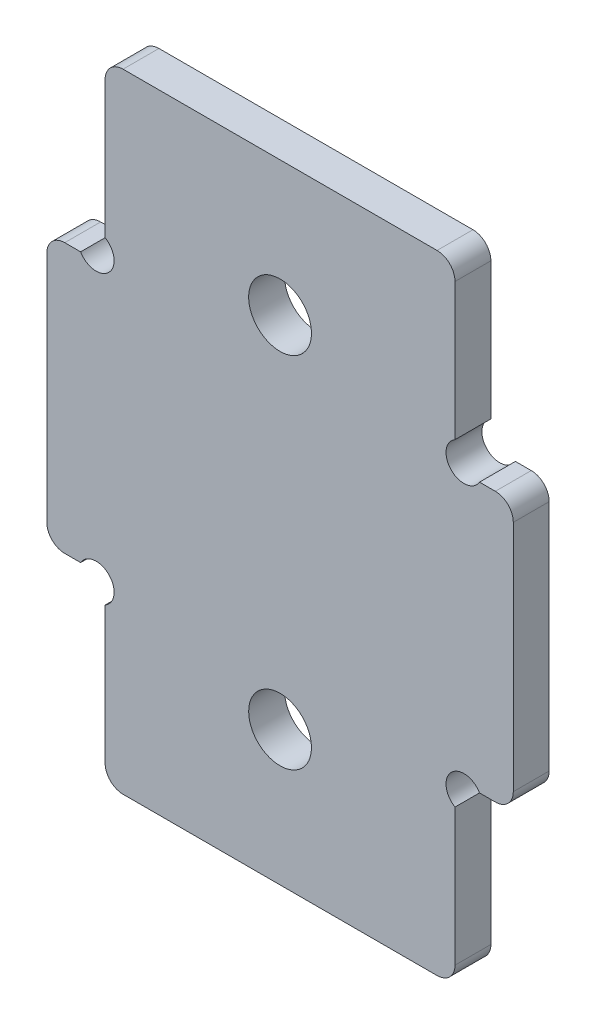
ISO-10303-21;
HEADER;
FILE_DESCRIPTION(('STEP AP214'),'2;1');
FILE_NAME('part.step','',(''),(''),'','','');
FILE_SCHEMA(('AUTOMOTIVE_DESIGN { 1 0 10303 214 1 1 1 1 }'));
ENDSEC;
DATA;
#1=APPLICATION_CONTEXT('core data for automotive mechanical design processes');
#2=APPLICATION_PROTOCOL_DEFINITION('international standard','automotive_design',2000,#1);
#3=PRODUCT_CONTEXT('',#1,'mechanical');
#4=PRODUCT('Part','Part','',(#3));
#5=PRODUCT_RELATED_PRODUCT_CATEGORY('part','',(#4));
#6=PRODUCT_DEFINITION_FORMATION('','',#4);
#7=PRODUCT_DEFINITION_CONTEXT('part definition',#1,'design');
#8=PRODUCT_DEFINITION('design','',#6,#7);
#9=PRODUCT_DEFINITION_SHAPE('','',#8);
#10=(LENGTH_UNIT() NAMED_UNIT(*) SI_UNIT(.MILLI.,.METRE.));
#11=(NAMED_UNIT(*) PLANE_ANGLE_UNIT() SI_UNIT($,.RADIAN.));
#12=(NAMED_UNIT(*) SI_UNIT($,.STERADIAN.) SOLID_ANGLE_UNIT());
#13=UNCERTAINTY_MEASURE_WITH_UNIT(LENGTH_MEASURE(1.E-05),#10,'distance_accuracy_value','');
#14=(GEOMETRIC_REPRESENTATION_CONTEXT(3) GLOBAL_UNCERTAINTY_ASSIGNED_CONTEXT((#13)) GLOBAL_UNIT_ASSIGNED_CONTEXT((#10,
#11,#12)) REPRESENTATION_CONTEXT('',''));
#15=CARTESIAN_POINT('',(0.,0.,0.));
#16=DIRECTION('',(0.,0.,1.));
#17=DIRECTION('',(1.,0.,0.));
#18=AXIS2_PLACEMENT_3D('',#15,#16,#17);
#19=CARTESIAN_POINT('',(0.,35.,2.));
#20=DIRECTION('',(1.,0.,0.));
#21=DIRECTION('',(0.,1.,0.));
#22=AXIS2_PLACEMENT_3D('',#19,#20,#21);
#23=PLANE('',#22);
#24=DIRECTION('',(0.,-1.,0.));
#25=VECTOR('',#24,1.);
#26=CARTESIAN_POINT('',(0.,35.,0.));
#27=LINE('',#26,#25);
#28=CARTESIAN_POINT('',(0.,8.63397459621554,0.));
#29=VERTEX_POINT('',#28);
#30=CARTESIAN_POINT('',(0.,1.,0.));
#31=VERTEX_POINT('',#30);
#32=EDGE_CURVE('E284',#29,#31,#27,.T.);
#33=ORIENTED_EDGE('',*,*,#32,.T.);
#34=DIRECTION('',(0.,0.,-1.));
#35=VECTOR('',#34,1.);
#36=CARTESIAN_POINT('',(0.,1.,2.));
#37=LINE('',#36,#35);
#38=CARTESIAN_POINT('',(0.,1.,2.));
#39=VERTEX_POINT('',#38);
#40=EDGE_CURVE('E356',#31,#39,#37,.F.);
#41=ORIENTED_EDGE('',*,*,#40,.T.);
#42=DIRECTION('',(0.,-1.,0.));
#43=VECTOR('',#42,1.);
#44=CARTESIAN_POINT('',(0.,35.,2.));
#45=LINE('',#44,#43);
#46=CARTESIAN_POINT('',(0.,8.63397459621554,2.));
#47=VERTEX_POINT('',#46);
#48=EDGE_CURVE('E274',#47,#39,#45,.T.);
#49=ORIENTED_EDGE('',*,*,#48,.F.);
#50=DIRECTION('',(0.,0.,1.));
#51=VECTOR('',#50,1.);
#52=CARTESIAN_POINT('',(0.,8.63397459621554,-8.));
#53=LINE('',#52,#51);
#54=EDGE_CURVE('E397',#47,#29,#53,.F.);
#55=ORIENTED_EDGE('',*,*,#54,.T.);
#56=EDGE_LOOP('',(#33,#41,#49,#55));
#57=FACE_BOUND('',#56,.T.);
#58=ADVANCED_FACE('F41',(#57),#23,.F.);
#59=CARTESIAN_POINT('',(19.5,0.,2.));
#60=DIRECTION('',(-1.,0.,0.));
#61=DIRECTION('',(0.,0.,1.));
#62=AXIS2_PLACEMENT_3D('',#59,#60,#61);
#63=PLANE('',#62);
#64=DIRECTION('',(0.,1.,0.));
#65=VECTOR('',#64,1.);
#66=CARTESIAN_POINT('',(19.5,0.,0.));
#67=LINE('',#66,#65);
#68=CARTESIAN_POINT('',(19.5,26.3660254037844,0.));
#69=VERTEX_POINT('',#68);
#70=CARTESIAN_POINT('',(19.5,34.,0.));
#71=VERTEX_POINT('',#70);
#72=EDGE_CURVE('E290',#69,#71,#67,.T.);
#73=ORIENTED_EDGE('',*,*,#72,.T.);
#74=DIRECTION('',(0.,0.,-1.));
#75=VECTOR('',#74,1.);
#76=CARTESIAN_POINT('',(19.5,34.,2.));
#77=LINE('',#76,#75);
#78=CARTESIAN_POINT('',(19.5,34.,2.));
#79=VERTEX_POINT('',#78);
#80=EDGE_CURVE('E11',#71,#79,#77,.F.);
#81=ORIENTED_EDGE('',*,*,#80,.T.);
#82=DIRECTION('',(0.,1.,0.));
#83=VECTOR('',#82,1.);
#84=CARTESIAN_POINT('',(19.5,0.,2.));
#85=LINE('',#84,#83);
#86=CARTESIAN_POINT('',(19.5,26.3660254037844,2.));
#87=VERTEX_POINT('',#86);
#88=EDGE_CURVE('E280',#87,#79,#85,.T.);
#89=ORIENTED_EDGE('',*,*,#88,.F.);
#90=DIRECTION('',(0.,0.,1.));
#91=VECTOR('',#90,1.);
#92=CARTESIAN_POINT('',(19.5,26.3660254037844,-8.));
#93=LINE('',#92,#91);
#94=EDGE_CURVE('E403',#87,#69,#93,.F.);
#95=ORIENTED_EDGE('',*,*,#94,.T.);
#96=EDGE_LOOP('',(#73,#81,#89,#95));
#97=FACE_BOUND('',#96,.T.);
#98=ADVANCED_FACE('F456',(#97),#63,.F.);
#99=CARTESIAN_POINT('',(19.5,35.,2.));
#100=DIRECTION('',(0.,-1.,0.));
#101=DIRECTION('',(0.,0.,-1.));
#102=AXIS2_PLACEMENT_3D('',#99,#100,#101);
#103=PLANE('',#102);
#104=DIRECTION('',(-1.,0.,0.));
#105=VECTOR('',#104,1.);
#106=CARTESIAN_POINT('',(19.5,35.,0.));
#107=LINE('',#106,#105);
#108=CARTESIAN_POINT('',(18.5,35.,0.));
#109=VERTEX_POINT('',#108);
#110=CARTESIAN_POINT('',(1.,35.,0.));
#111=VERTEX_POINT('',#110);
#112=EDGE_CURVE('E263',#109,#111,#107,.T.);
#113=ORIENTED_EDGE('',*,*,#112,.T.);
#114=DIRECTION('',(0.,0.,-1.));
#115=VECTOR('',#114,1.);
#116=CARTESIAN_POINT('',(1.,35.,2.));
#117=LINE('',#116,#115);
#118=CARTESIAN_POINT('',(1.,35.,2.));
#119=VERTEX_POINT('',#118);
#120=EDGE_CURVE('E321',#111,#119,#117,.F.);
#121=ORIENTED_EDGE('',*,*,#120,.T.);
#122=DIRECTION('',(-1.,0.,0.));
#123=VECTOR('',#122,1.);
#124=CARTESIAN_POINT('',(19.5,35.,2.));
#125=LINE('',#124,#123);
#126=CARTESIAN_POINT('',(18.5,35.,2.));
#127=VERTEX_POINT('',#126);
#128=EDGE_CURVE('E272',#127,#119,#125,.T.);
#129=ORIENTED_EDGE('',*,*,#128,.F.);
#130=DIRECTION('',(0.,0.,-1.));
#131=VECTOR('',#130,1.);
#132=CARTESIAN_POINT('',(18.5,35.,2.));
#133=LINE('',#132,#131);
#134=EDGE_CURVE('E318',#127,#109,#133,.T.);
#135=ORIENTED_EDGE('',*,*,#134,.T.);
#136=EDGE_LOOP('',(#113,#121,#129,#135));
#137=FACE_BOUND('',#136,.T.);
#138=ADVANCED_FACE('F463',(#137),#103,.F.);
#139=CARTESIAN_POINT('',(0.,34.,2.));
#140=VERTEX_POINT('',#139);
#141=CARTESIAN_POINT('',(0.,26.3660254037844,2.));
#142=VERTEX_POINT('',#141);
#143=EDGE_CURVE('E223',#140,#142,#45,.T.);
#144=ORIENTED_EDGE('',*,*,#143,.F.);
#145=DIRECTION('',(0.,0.,-1.));
#146=VECTOR('',#145,1.);
#147=CARTESIAN_POINT('',(0.,34.,2.));
#148=LINE('',#147,#146);
#149=CARTESIAN_POINT('',(0.,34.,0.));
#150=VERTEX_POINT('',#149);
#151=EDGE_CURVE('E299',#140,#150,#148,.T.);
#152=ORIENTED_EDGE('',*,*,#151,.T.);
#153=CARTESIAN_POINT('',(0.,26.3660254037844,0.));
#154=VERTEX_POINT('',#153);
#155=EDGE_CURVE('E285',#150,#154,#27,.T.);
#156=ORIENTED_EDGE('',*,*,#155,.T.);
#157=DIRECTION('',(0.,0.,1.));
#158=VECTOR('',#157,1.);
#159=CARTESIAN_POINT('',(0.,26.3660254037844,-8.));
#160=LINE('',#159,#158);
#161=EDGE_CURVE('E388',#154,#142,#160,.T.);
#162=ORIENTED_EDGE('',*,*,#161,.T.);
#163=EDGE_LOOP('',(#144,#152,#156,#162));
#164=FACE_BOUND('',#163,.T.);
#165=ADVANCED_FACE('F470',(#164),#23,.F.);
#166=CARTESIAN_POINT('',(0.,0.,2.));
#167=DIRECTION('',(0.,1.,0.));
#168=DIRECTION('',(0.,0.,1.));
#169=AXIS2_PLACEMENT_3D('',#166,#167,#168);
#170=PLANE('',#169);
#171=DIRECTION('',(1.,0.,0.));
#172=VECTOR('',#171,1.);
#173=CARTESIAN_POINT('',(0.,0.,0.));
#174=LINE('',#173,#172);
#175=CARTESIAN_POINT('',(1.,0.,0.));
#176=VERTEX_POINT('',#175);
#177=CARTESIAN_POINT('',(18.5,0.,0.));
#178=VERTEX_POINT('',#177);
#179=EDGE_CURVE('E287',#176,#178,#174,.T.);
#180=ORIENTED_EDGE('',*,*,#179,.T.);
#181=DIRECTION('',(0.,0.,-1.));
#182=VECTOR('',#181,1.);
#183=CARTESIAN_POINT('',(18.5,0.,2.));
#184=LINE('',#183,#182);
#185=CARTESIAN_POINT('',(18.5,0.,2.));
#186=VERTEX_POINT('',#185);
#187=EDGE_CURVE('E354',#178,#186,#184,.F.);
#188=ORIENTED_EDGE('',*,*,#187,.T.);
#189=DIRECTION('',(1.,0.,0.));
#190=VECTOR('',#189,1.);
#191=CARTESIAN_POINT('',(0.,0.,2.));
#192=LINE('',#191,#190);
#193=CARTESIAN_POINT('',(1.,0.,2.));
#194=VERTEX_POINT('',#193);
#195=EDGE_CURVE('E277',#194,#186,#192,.T.);
#196=ORIENTED_EDGE('',*,*,#195,.F.);
#197=DIRECTION('',(0.,0.,-1.));
#198=VECTOR('',#197,1.);
#199=CARTESIAN_POINT('',(1.,0.,2.));
#200=LINE('',#199,#198);
#201=EDGE_CURVE('E351',#194,#176,#200,.T.);
#202=ORIENTED_EDGE('',*,*,#201,.T.);
#203=EDGE_LOOP('',(#180,#188,#196,#202));
#204=FACE_BOUND('',#203,.T.);
#205=ADVANCED_FACE('F472',(#204),#170,.F.);
#206=CARTESIAN_POINT('',(19.5,1.,2.));
#207=VERTEX_POINT('',#206);
#208=CARTESIAN_POINT('',(19.5,8.63397459621554,2.));
#209=VERTEX_POINT('',#208);
#210=EDGE_CURVE('E215',#207,#209,#85,.T.);
#211=ORIENTED_EDGE('',*,*,#210,.F.);
#212=DIRECTION('',(0.,0.,-1.));
#213=VECTOR('',#212,1.);
#214=CARTESIAN_POINT('',(19.5,1.,2.));
#215=LINE('',#214,#213);
#216=CARTESIAN_POINT('',(19.5,1.,0.));
#217=VERTEX_POINT('',#216);
#218=EDGE_CURVE('E348',#207,#217,#215,.T.);
#219=ORIENTED_EDGE('',*,*,#218,.T.);
#220=CARTESIAN_POINT('',(19.5,8.63397459621554,0.));
#221=VERTEX_POINT('',#220);
#222=EDGE_CURVE('E275',#217,#221,#67,.T.);
#223=ORIENTED_EDGE('',*,*,#222,.T.);
#224=DIRECTION('',(0.,0.,1.));
#225=VECTOR('',#224,1.);
#226=CARTESIAN_POINT('',(19.5,8.63397459621554,-8.));
#227=LINE('',#226,#225);
#228=EDGE_CURVE('E243',#221,#209,#227,.T.);
#229=ORIENTED_EDGE('',*,*,#228,.T.);
#230=EDGE_LOOP('',(#211,#219,#223,#229));
#231=FACE_BOUND('',#230,.T.);
#232=ADVANCED_FACE('F427',(#231),#63,.F.);
#233=CARTESIAN_POINT('',(0.,0.,2.));
#234=DIRECTION('',(0.,0.,1.));
#235=DIRECTION('',(1.,0.,0.));
#236=AXIS2_PLACEMENT_3D('',#233,#234,#235);
#237=PLANE('',#236);
#238=ORIENTED_EDGE('',*,*,#128,.T.);
#239=CARTESIAN_POINT('',(1.,34.,2.));
#240=DIRECTION('',(0.,0.,1.));
#241=DIRECTION('',(1.,0.,0.));
#242=AXIS2_PLACEMENT_3D('',#239,#240,#241);
#243=CIRCLE('',#242,1.);
#244=EDGE_CURVE('E336',#119,#140,#243,.T.);
#245=ORIENTED_EDGE('',*,*,#244,.T.);
#246=ORIENTED_EDGE('',*,*,#143,.T.);
#247=CARTESIAN_POINT('',(-0.499999999999997,25.5,2.));
#248=DIRECTION('',(0.,0.,1.));
#249=DIRECTION('',(-1.,0.,0.));
#250=AXIS2_PLACEMENT_3D('',#247,#248,#249);
#251=CIRCLE('',#250,1.);
#252=CARTESIAN_POINT('',(-1.36602540378444,25.,2.));
#253=VERTEX_POINT('',#252);
#254=EDGE_CURVE('E206',#253,#142,#251,.T.);
#255=ORIENTED_EDGE('',*,*,#254,.F.);
#256=DIRECTION('',(-1.,0.,0.));
#257=VECTOR('',#256,1.);
#258=CARTESIAN_POINT('',(0.,25.,2.));
#259=LINE('',#258,#257);
#260=CARTESIAN_POINT('',(-2.25000000000001,25.,2.));
#261=VERTEX_POINT('',#260);
#262=EDGE_CURVE('E221',#253,#261,#259,.T.);
#263=ORIENTED_EDGE('',*,*,#262,.T.);
#264=CARTESIAN_POINT('',(-2.25000000000001,24.,2.));
#265=DIRECTION('',(0.,0.,1.));
#266=DIRECTION('',(1.,0.,0.));
#267=AXIS2_PLACEMENT_3D('',#264,#265,#266);
#268=CIRCLE('',#267,1.);
#269=CARTESIAN_POINT('',(-3.25000000000001,24.,2.));
#270=VERTEX_POINT('',#269);
#271=EDGE_CURVE('E325',#261,#270,#268,.T.);
#272=ORIENTED_EDGE('',*,*,#271,.T.);
#273=DIRECTION('',(0.,-1.,0.));
#274=VECTOR('',#273,1.);
#275=CARTESIAN_POINT('',(-3.25000000000001,25.,2.));
#276=LINE('',#275,#274);
#277=CARTESIAN_POINT('',(-3.25,11.,2.));
#278=VERTEX_POINT('',#277);
#279=EDGE_CURVE('E230',#270,#278,#276,.T.);
#280=ORIENTED_EDGE('',*,*,#279,.T.);
#281=CARTESIAN_POINT('',(-2.25,11.,2.));
#282=DIRECTION('',(0.,0.,1.));
#283=DIRECTION('',(1.,0.,0.));
#284=AXIS2_PLACEMENT_3D('',#281,#282,#283);
#285=CIRCLE('',#284,1.);
#286=CARTESIAN_POINT('',(-2.25,10.,2.));
#287=VERTEX_POINT('',#286);
#288=EDGE_CURVE('E327',#278,#287,#285,.T.);
#289=ORIENTED_EDGE('',*,*,#288,.T.);
#290=DIRECTION('',(1.,0.,0.));
#291=VECTOR('',#290,1.);
#292=CARTESIAN_POINT('',(0.,10.,2.));
#293=LINE('',#292,#291);
#294=CARTESIAN_POINT('',(-1.3660254037844,10.,2.));
#295=VERTEX_POINT('',#294);
#296=EDGE_CURVE('E236',#287,#295,#293,.T.);
#297=ORIENTED_EDGE('',*,*,#296,.T.);
#298=CARTESIAN_POINT('',(-0.499999999999962,9.5,2.));
#299=DIRECTION('',(0.,0.,1.));
#300=DIRECTION('',(1.,0.,0.));
#301=AXIS2_PLACEMENT_3D('',#298,#299,#300);
#302=CIRCLE('',#301,1.);
#303=EDGE_CURVE('E224',#47,#295,#302,.T.);
#304=ORIENTED_EDGE('',*,*,#303,.F.);
#305=ORIENTED_EDGE('',*,*,#48,.T.);
#306=CARTESIAN_POINT('',(1.,1.,2.));
#307=DIRECTION('',(0.,0.,1.));
#308=DIRECTION('',(1.,0.,0.));
#309=AXIS2_PLACEMENT_3D('',#306,#307,#308);
#310=CIRCLE('',#309,1.);
#311=EDGE_CURVE('E329',#39,#194,#310,.T.);
#312=ORIENTED_EDGE('',*,*,#311,.T.);
#313=ORIENTED_EDGE('',*,*,#195,.T.);
#314=CARTESIAN_POINT('',(18.5,1.,2.));
#315=DIRECTION('',(0.,0.,1.));
#316=DIRECTION('',(1.,0.,0.));
#317=AXIS2_PLACEMENT_3D('',#314,#315,#316);
#318=CIRCLE('',#317,1.);
#319=EDGE_CURVE('E331',#186,#207,#318,.T.);
#320=ORIENTED_EDGE('',*,*,#319,.T.);
#321=ORIENTED_EDGE('',*,*,#210,.T.);
#322=CARTESIAN_POINT('',(20.,9.5,2.));
#323=DIRECTION('',(0.,0.,1.));
#324=DIRECTION('',(-1.,0.,0.));
#325=AXIS2_PLACEMENT_3D('',#322,#323,#324);
#326=CIRCLE('',#325,1.);
#327=CARTESIAN_POINT('',(20.8660254037844,10.,2.));
#328=VERTEX_POINT('',#327);
#329=EDGE_CURVE('E393',#328,#209,#326,.T.);
#330=ORIENTED_EDGE('',*,*,#329,.F.);
#331=DIRECTION('',(1.,0.,0.));
#332=VECTOR('',#331,1.);
#333=CARTESIAN_POINT('',(19.5,10.,2.));
#334=LINE('',#333,#332);
#335=CARTESIAN_POINT('',(21.75,10.,2.));
#336=VERTEX_POINT('',#335);
#337=EDGE_CURVE('E229',#328,#336,#334,.T.);
#338=ORIENTED_EDGE('',*,*,#337,.T.);
#339=CARTESIAN_POINT('',(21.75,11.,2.));
#340=DIRECTION('',(0.,0.,1.));
#341=DIRECTION('',(1.,0.,0.));
#342=AXIS2_PLACEMENT_3D('',#339,#340,#341);
#343=CIRCLE('',#342,1.);
#344=CARTESIAN_POINT('',(22.75,11.,2.));
#345=VERTEX_POINT('',#344);
#346=EDGE_CURVE('E333',#336,#345,#343,.T.);
#347=ORIENTED_EDGE('',*,*,#346,.T.);
#348=DIRECTION('',(0.,1.,0.));
#349=VECTOR('',#348,1.);
#350=CARTESIAN_POINT('',(22.75,25.,2.));
#351=LINE('',#350,#349);
#352=CARTESIAN_POINT('',(22.75,24.,2.));
#353=VERTEX_POINT('',#352);
#354=EDGE_CURVE('E233',#345,#353,#351,.T.);
#355=ORIENTED_EDGE('',*,*,#354,.T.);
#356=CARTESIAN_POINT('',(21.75,24.,2.));
#357=DIRECTION('',(0.,0.,1.));
#358=DIRECTION('',(1.,0.,0.));
#359=AXIS2_PLACEMENT_3D('',#356,#357,#358);
#360=CIRCLE('',#359,1.);
#361=CARTESIAN_POINT('',(21.75,25.,2.));
#362=VERTEX_POINT('',#361);
#363=EDGE_CURVE('E62',#353,#362,#360,.T.);
#364=ORIENTED_EDGE('',*,*,#363,.T.);
#365=DIRECTION('',(-1.,0.,0.));
#366=VECTOR('',#365,1.);
#367=CARTESIAN_POINT('',(19.5,25.,2.));
#368=LINE('',#367,#366);
#369=CARTESIAN_POINT('',(20.8660254037844,25.,2.));
#370=VERTEX_POINT('',#369);
#371=EDGE_CURVE('E252',#362,#370,#368,.T.);
#372=ORIENTED_EDGE('',*,*,#371,.T.);
#373=CARTESIAN_POINT('',(20.,25.5,2.));
#374=DIRECTION('',(0.,0.,1.));
#375=DIRECTION('',(1.,0.,0.));
#376=AXIS2_PLACEMENT_3D('',#373,#374,#375);
#377=CIRCLE('',#376,1.);
#378=EDGE_CURVE('E389',#87,#370,#377,.T.);
#379=ORIENTED_EDGE('',*,*,#378,.F.);
#380=ORIENTED_EDGE('',*,*,#88,.T.);
#381=CARTESIAN_POINT('',(18.5,34.,2.));
#382=DIRECTION('',(0.,0.,1.));
#383=DIRECTION('',(1.,0.,0.));
#384=AXIS2_PLACEMENT_3D('',#381,#382,#383);
#385=CIRCLE('',#384,1.);
#386=EDGE_CURVE('E323',#79,#127,#385,.T.);
#387=ORIENTED_EDGE('',*,*,#386,.T.);
#388=EDGE_LOOP('',(#238,#245,#246,#255,#263,#272,#280,#289,#297,#304,#305,#312,#313,#320,#321,
#330,#338,#347,#355,#364,#372,#379,#380,#387));
#389=FACE_BOUND('',#388,.T.);
#390=CARTESIAN_POINT('',(9.75,27.5,2.));
#391=DIRECTION('',(0.,0.,1.));
#392=DIRECTION('',(1.,0.,0.));
#393=AXIS2_PLACEMENT_3D('',#390,#391,#392);
#394=CIRCLE('',#393,1.75);
#395=CARTESIAN_POINT('',(11.5,27.5,2.));
#396=VERTEX_POINT('',#395);
#397=EDGE_CURVE('E264',#396,#396,#394,.T.);
#398=ORIENTED_EDGE('',*,*,#397,.F.);
#399=EDGE_LOOP('',(#398));
#400=FACE_BOUND('',#399,.T.);
#401=CARTESIAN_POINT('',(9.75,7.5,2.));
#402=DIRECTION('',(0.,0.,1.));
#403=DIRECTION('',(-1.,0.,0.));
#404=AXIS2_PLACEMENT_3D('',#401,#402,#403);
#405=CIRCLE('',#404,1.75);
#406=CARTESIAN_POINT('',(8.,7.5,2.));
#407=VERTEX_POINT('',#406);
#408=EDGE_CURVE('E267',#407,#407,#405,.T.);
#409=ORIENTED_EDGE('',*,*,#408,.F.);
#410=EDGE_LOOP('',(#409));
#411=FACE_BOUND('',#410,.T.);
#412=ADVANCED_FACE('F219',(#389,#400,#411),#237,.T.);
#413=CARTESIAN_POINT('',(0.,0.,0.));
#414=DIRECTION('',(0.,0.,1.));
#415=DIRECTION('',(1.,0.,0.));
#416=AXIS2_PLACEMENT_3D('',#413,#414,#415);
#417=PLANE('',#416);
#418=CARTESIAN_POINT('',(9.75,27.5,0.));
#419=DIRECTION('',(0.,0.,1.));
#420=DIRECTION('',(1.,0.,0.));
#421=AXIS2_PLACEMENT_3D('',#418,#419,#420);
#422=CIRCLE('',#421,1.75);
#423=CARTESIAN_POINT('',(11.5,27.5,0.));
#424=VERTEX_POINT('',#423);
#425=EDGE_CURVE('E260',#424,#424,#422,.T.);
#426=ORIENTED_EDGE('',*,*,#425,.T.);
#427=EDGE_LOOP('',(#426));
#428=FACE_BOUND('',#427,.T.);
#429=CARTESIAN_POINT('',(9.75,7.5,0.));
#430=DIRECTION('',(0.,0.,1.));
#431=DIRECTION('',(-1.,0.,0.));
#432=AXIS2_PLACEMENT_3D('',#429,#430,#431);
#433=CIRCLE('',#432,1.75);
#434=CARTESIAN_POINT('',(8.,7.5,0.));
#435=VERTEX_POINT('',#434);
#436=EDGE_CURVE('E256',#435,#435,#433,.T.);
#437=ORIENTED_EDGE('',*,*,#436,.T.);
#438=EDGE_LOOP('',(#437));
#439=FACE_BOUND('',#438,.T.);
#440=ORIENTED_EDGE('',*,*,#155,.F.);
#441=CARTESIAN_POINT('',(1.,34.,0.));
#442=DIRECTION('',(0.,0.,1.));
#443=DIRECTION('',(1.,0.,0.));
#444=AXIS2_PLACEMENT_3D('',#441,#442,#443);
#445=CIRCLE('',#444,1.);
#446=EDGE_CURVE('E316',#150,#111,#445,.F.);
#447=ORIENTED_EDGE('',*,*,#446,.T.);
#448=ORIENTED_EDGE('',*,*,#112,.F.);
#449=CARTESIAN_POINT('',(18.5,34.,0.));
#450=DIRECTION('',(0.,0.,1.));
#451=DIRECTION('',(1.,0.,0.));
#452=AXIS2_PLACEMENT_3D('',#449,#450,#451);
#453=CIRCLE('',#452,1.);
#454=EDGE_CURVE('E302',#109,#71,#453,.F.);
#455=ORIENTED_EDGE('',*,*,#454,.T.);
#456=ORIENTED_EDGE('',*,*,#72,.F.);
#457=CARTESIAN_POINT('',(20.,25.5,0.));
#458=DIRECTION('',(0.,0.,1.));
#459=DIRECTION('',(1.,0.,0.));
#460=AXIS2_PLACEMENT_3D('',#457,#458,#459);
#461=CIRCLE('',#460,1.);
#462=CARTESIAN_POINT('',(20.8660254037844,25.,0.));
#463=VERTEX_POINT('',#462);
#464=EDGE_CURVE('E400',#69,#463,#461,.T.);
#465=ORIENTED_EDGE('',*,*,#464,.T.);
#466=DIRECTION('',(-1.,0.,0.));
#467=VECTOR('',#466,1.);
#468=CARTESIAN_POINT('',(19.5,25.,0.));
#469=LINE('',#468,#467);
#470=CARTESIAN_POINT('',(21.75,25.,0.));
#471=VERTEX_POINT('',#470);
#472=EDGE_CURVE('E255',#471,#463,#469,.T.);
#473=ORIENTED_EDGE('',*,*,#472,.F.);
#474=CARTESIAN_POINT('',(21.75,24.,0.));
#475=DIRECTION('',(0.,0.,1.));
#476=DIRECTION('',(1.,0.,0.));
#477=AXIS2_PLACEMENT_3D('',#474,#475,#476);
#478=CIRCLE('',#477,1.);
#479=CARTESIAN_POINT('',(22.75,24.,0.));
#480=VERTEX_POINT('',#479);
#481=EDGE_CURVE('E314',#471,#480,#478,.F.);
#482=ORIENTED_EDGE('',*,*,#481,.T.);
#483=DIRECTION('',(0.,1.,0.));
#484=VECTOR('',#483,1.);
#485=CARTESIAN_POINT('',(22.75,25.,0.));
#486=LINE('',#485,#484);
#487=CARTESIAN_POINT('',(22.75,11.,0.));
#488=VERTEX_POINT('',#487);
#489=EDGE_CURVE('E251',#488,#480,#486,.T.);
#490=ORIENTED_EDGE('',*,*,#489,.F.);
#491=CARTESIAN_POINT('',(21.75,11.,0.));
#492=DIRECTION('',(0.,0.,1.));
#493=DIRECTION('',(1.,0.,0.));
#494=AXIS2_PLACEMENT_3D('',#491,#492,#493);
#495=CIRCLE('',#494,1.);
#496=CARTESIAN_POINT('',(21.75,10.,0.));
#497=VERTEX_POINT('',#496);
#498=EDGE_CURVE('E312',#488,#497,#495,.F.);
#499=ORIENTED_EDGE('',*,*,#498,.T.);
#500=DIRECTION('',(1.,0.,0.));
#501=VECTOR('',#500,1.);
#502=CARTESIAN_POINT('',(19.5,10.,0.));
#503=LINE('',#502,#501);
#504=CARTESIAN_POINT('',(20.8660254037844,10.,0.));
#505=VERTEX_POINT('',#504);
#506=EDGE_CURVE('E248',#505,#497,#503,.T.);
#507=ORIENTED_EDGE('',*,*,#506,.F.);
#508=CARTESIAN_POINT('',(20.,9.5,0.));
#509=DIRECTION('',(0.,0.,1.));
#510=DIRECTION('',(1.,0.,0.));
#511=AXIS2_PLACEMENT_3D('',#508,#509,#510);
#512=CIRCLE('',#511,1.);
#513=EDGE_CURVE('E406',#505,#221,#512,.T.);
#514=ORIENTED_EDGE('',*,*,#513,.T.);
#515=ORIENTED_EDGE('',*,*,#222,.F.);
#516=CARTESIAN_POINT('',(18.5,1.,0.));
#517=DIRECTION('',(0.,0.,1.));
#518=DIRECTION('',(1.,0.,0.));
#519=AXIS2_PLACEMENT_3D('',#516,#517,#518);
#520=CIRCLE('',#519,1.);
#521=EDGE_CURVE('E310',#217,#178,#520,.F.);
#522=ORIENTED_EDGE('',*,*,#521,.T.);
#523=ORIENTED_EDGE('',*,*,#179,.F.);
#524=CARTESIAN_POINT('',(1.,1.,0.));
#525=DIRECTION('',(0.,0.,1.));
#526=DIRECTION('',(1.,0.,0.));
#527=AXIS2_PLACEMENT_3D('',#524,#525,#526);
#528=CIRCLE('',#527,1.);
#529=EDGE_CURVE('E308',#176,#31,#528,.F.);
#530=ORIENTED_EDGE('',*,*,#529,.T.);
#531=ORIENTED_EDGE('',*,*,#32,.F.);
#532=CARTESIAN_POINT('',(-0.499999999999962,9.5,0.));
#533=DIRECTION('',(0.,0.,1.));
#534=DIRECTION('',(1.,0.,0.));
#535=AXIS2_PLACEMENT_3D('',#532,#533,#534);
#536=CIRCLE('',#535,1.);
#537=CARTESIAN_POINT('',(-1.3660254037844,10.,0.));
#538=VERTEX_POINT('',#537);
#539=EDGE_CURVE('E378',#29,#538,#536,.T.);
#540=ORIENTED_EDGE('',*,*,#539,.T.);
#541=DIRECTION('',(1.,0.,0.));
#542=VECTOR('',#541,1.);
#543=CARTESIAN_POINT('',(0.,10.,0.));
#544=LINE('',#543,#542);
#545=CARTESIAN_POINT('',(-2.25,10.,0.));
#546=VERTEX_POINT('',#545);
#547=EDGE_CURVE('E240',#546,#538,#544,.T.);
#548=ORIENTED_EDGE('',*,*,#547,.F.);
#549=CARTESIAN_POINT('',(-2.25,11.,0.));
#550=DIRECTION('',(0.,0.,1.));
#551=DIRECTION('',(1.,0.,0.));
#552=AXIS2_PLACEMENT_3D('',#549,#550,#551);
#553=CIRCLE('',#552,1.);
#554=CARTESIAN_POINT('',(-3.25,11.,0.));
#555=VERTEX_POINT('',#554);
#556=EDGE_CURVE('E306',#546,#555,#553,.F.);
#557=ORIENTED_EDGE('',*,*,#556,.T.);
#558=DIRECTION('',(0.,-1.,0.));
#559=VECTOR('',#558,1.);
#560=CARTESIAN_POINT('',(-3.25000000000001,25.,0.));
#561=LINE('',#560,#559);
#562=CARTESIAN_POINT('',(-3.25000000000001,24.,0.));
#563=VERTEX_POINT('',#562);
#564=EDGE_CURVE('E242',#563,#555,#561,.T.);
#565=ORIENTED_EDGE('',*,*,#564,.F.);
#566=CARTESIAN_POINT('',(-2.25000000000001,24.,0.));
#567=DIRECTION('',(0.,0.,1.));
#568=DIRECTION('',(1.,0.,0.));
#569=AXIS2_PLACEMENT_3D('',#566,#567,#568);
#570=CIRCLE('',#569,1.);
#571=CARTESIAN_POINT('',(-2.25000000000001,25.,0.));
#572=VERTEX_POINT('',#571);
#573=EDGE_CURVE('E304',#563,#572,#570,.F.);
#574=ORIENTED_EDGE('',*,*,#573,.T.);
#575=DIRECTION('',(-1.,0.,0.));
#576=VECTOR('',#575,1.);
#577=CARTESIAN_POINT('',(0.,25.,0.));
#578=LINE('',#577,#576);
#579=CARTESIAN_POINT('',(-1.36602540378444,25.,0.));
#580=VERTEX_POINT('',#579);
#581=EDGE_CURVE('E246',#580,#572,#578,.T.);
#582=ORIENTED_EDGE('',*,*,#581,.F.);
#583=CARTESIAN_POINT('',(-0.499999999999997,25.5,0.));
#584=DIRECTION('',(0.,0.,1.));
#585=DIRECTION('',(1.,0.,0.));
#586=AXIS2_PLACEMENT_3D('',#583,#584,#585);
#587=CIRCLE('',#586,1.);
#588=EDGE_CURVE('E209',#580,#154,#587,.T.);
#589=ORIENTED_EDGE('',*,*,#588,.T.);
#590=EDGE_LOOP('',(#440,#447,#448,#455,#456,#465,#473,#482,#490,#499,#507,#514,#515,#522,#523,
#530,#531,#540,#548,#557,#565,#574,#582,#589));
#591=FACE_BOUND('',#590,.T.);
#592=ADVANCED_FACE('F375',(#428,#439,#591),#417,.F.);
#593=CARTESIAN_POINT('',(9.75,7.5,0.));
#594=DIRECTION('',(0.,0.,1.));
#595=DIRECTION('',(1.,0.,0.));
#596=AXIS2_PLACEMENT_3D('',#593,#594,#595);
#597=CYLINDRICAL_SURFACE('',#596,1.75);
#598=ORIENTED_EDGE('',*,*,#436,.F.);
#599=EDGE_LOOP('',(#598));
#600=FACE_BOUND('',#599,.T.);
#601=ORIENTED_EDGE('',*,*,#408,.T.);
#602=EDGE_LOOP('',(#601));
#603=FACE_BOUND('',#602,.T.);
#604=ADVANCED_FACE('F648',(#600,#603),#597,.F.);
#605=CARTESIAN_POINT('',(9.75,27.5,0.));
#606=DIRECTION('',(0.,0.,1.));
#607=DIRECTION('',(1.,0.,0.));
#608=AXIS2_PLACEMENT_3D('',#605,#606,#607);
#609=CYLINDRICAL_SURFACE('',#608,1.75);
#610=ORIENTED_EDGE('',*,*,#425,.F.);
#611=EDGE_LOOP('',(#610));
#612=FACE_BOUND('',#611,.T.);
#613=ORIENTED_EDGE('',*,*,#397,.T.);
#614=EDGE_LOOP('',(#613));
#615=FACE_BOUND('',#614,.T.);
#616=ADVANCED_FACE('F639',(#612,#615),#609,.F.);
#617=CARTESIAN_POINT('',(19.5,10.,0.));
#618=DIRECTION('',(0.,-1.,0.));
#619=DIRECTION('',(0.,0.,-1.));
#620=AXIS2_PLACEMENT_3D('',#617,#618,#619);
#621=PLANE('',#620);
#622=ORIENTED_EDGE('',*,*,#506,.T.);
#623=DIRECTION('',(0.,0.,1.));
#624=VECTOR('',#623,1.);
#625=CARTESIAN_POINT('',(21.75,10.,0.));
#626=LINE('',#625,#624);
#627=EDGE_CURVE('E345',#497,#336,#626,.T.);
#628=ORIENTED_EDGE('',*,*,#627,.T.);
#629=ORIENTED_EDGE('',*,*,#337,.F.);
#630=DIRECTION('',(0.,0.,1.));
#631=VECTOR('',#630,1.);
#632=CARTESIAN_POINT('',(20.8660254037844,10.,-8.));
#633=LINE('',#632,#631);
#634=EDGE_CURVE('E297',#505,#328,#633,.T.);
#635=ORIENTED_EDGE('',*,*,#634,.F.);
#636=EDGE_LOOP('',(#622,#628,#629,#635));
#637=FACE_BOUND('',#636,.T.);
#638=ADVANCED_FACE('F433',(#637),#621,.T.);
#639=CARTESIAN_POINT('',(19.5,25.,0.));
#640=DIRECTION('',(0.,1.,0.));
#641=DIRECTION('',(0.,0.,1.));
#642=AXIS2_PLACEMENT_3D('',#639,#640,#641);
#643=PLANE('',#642);
#644=ORIENTED_EDGE('',*,*,#371,.F.);
#645=DIRECTION('',(0.,0.,1.));
#646=VECTOR('',#645,1.);
#647=CARTESIAN_POINT('',(21.75,25.,0.));
#648=LINE('',#647,#646);
#649=EDGE_CURVE('E343',#362,#471,#648,.F.);
#650=ORIENTED_EDGE('',*,*,#649,.T.);
#651=ORIENTED_EDGE('',*,*,#472,.T.);
#652=DIRECTION('',(0.,0.,1.));
#653=VECTOR('',#652,1.);
#654=CARTESIAN_POINT('',(20.8660254037844,25.,-8.));
#655=LINE('',#654,#653);
#656=EDGE_CURVE('E294',#370,#463,#655,.F.);
#657=ORIENTED_EDGE('',*,*,#656,.F.);
#658=EDGE_LOOP('',(#644,#650,#651,#657));
#659=FACE_BOUND('',#658,.T.);
#660=ADVANCED_FACE('F450',(#659),#643,.T.);
#661=CARTESIAN_POINT('',(22.75,25.,0.));
#662=DIRECTION('',(1.,0.,0.));
#663=DIRECTION('',(0.,0.,-1.));
#664=AXIS2_PLACEMENT_3D('',#661,#662,#663);
#665=PLANE('',#664);
#666=ORIENTED_EDGE('',*,*,#489,.T.);
#667=DIRECTION('',(0.,0.,1.));
#668=VECTOR('',#667,1.);
#669=CARTESIAN_POINT('',(22.75,24.,0.));
#670=LINE('',#669,#668);
#671=EDGE_CURVE('E340',#480,#353,#670,.T.);
#672=ORIENTED_EDGE('',*,*,#671,.T.);
#673=ORIENTED_EDGE('',*,*,#354,.F.);
#674=DIRECTION('',(0.,0.,1.));
#675=VECTOR('',#674,1.);
#676=CARTESIAN_POINT('',(22.75,11.,0.));
#677=LINE('',#676,#675);
#678=EDGE_CURVE('E338',#345,#488,#677,.F.);
#679=ORIENTED_EDGE('',*,*,#678,.T.);
#680=EDGE_LOOP('',(#666,#672,#673,#679));
#681=FACE_BOUND('',#680,.T.);
#682=ADVANCED_FACE('F439',(#681),#665,.T.);
#683=CARTESIAN_POINT('',(0.,10.,0.));
#684=DIRECTION('',(0.,-1.,0.));
#685=DIRECTION('',(1.,0.,0.));
#686=AXIS2_PLACEMENT_3D('',#683,#684,#685);
#687=PLANE('',#686);
#688=ORIENTED_EDGE('',*,*,#296,.F.);
#689=DIRECTION('',(0.,0.,1.));
#690=VECTOR('',#689,1.);
#691=CARTESIAN_POINT('',(-2.25,10.,0.));
#692=LINE('',#691,#690);
#693=EDGE_CURVE('E363',#287,#546,#692,.F.);
#694=ORIENTED_EDGE('',*,*,#693,.T.);
#695=ORIENTED_EDGE('',*,*,#547,.T.);
#696=DIRECTION('',(0.,0.,1.));
#697=VECTOR('',#696,1.);
#698=CARTESIAN_POINT('',(-1.3660254037844,10.,-8.));
#699=LINE('',#698,#697);
#700=EDGE_CURVE('E214',#295,#538,#699,.F.);
#701=ORIENTED_EDGE('',*,*,#700,.F.);
#702=EDGE_LOOP('',(#688,#694,#695,#701));
#703=FACE_BOUND('',#702,.T.);
#704=ADVANCED_FACE('F368',(#703),#687,.T.);
#705=CARTESIAN_POINT('',(-3.25000000000001,25.,0.));
#706=DIRECTION('',(-1.,0.,0.));
#707=DIRECTION('',(0.,-1.,0.));
#708=AXIS2_PLACEMENT_3D('',#705,#706,#707);
#709=PLANE('',#708);
#710=ORIENTED_EDGE('',*,*,#564,.T.);
#711=DIRECTION('',(0.,0.,1.));
#712=VECTOR('',#711,1.);
#713=CARTESIAN_POINT('',(-3.25,11.,0.));
#714=LINE('',#713,#712);
#715=EDGE_CURVE('E360',#555,#278,#714,.T.);
#716=ORIENTED_EDGE('',*,*,#715,.T.);
#717=ORIENTED_EDGE('',*,*,#279,.F.);
#718=DIRECTION('',(0.,0.,1.));
#719=VECTOR('',#718,1.);
#720=CARTESIAN_POINT('',(-3.25000000000001,24.,0.));
#721=LINE('',#720,#719);
#722=EDGE_CURVE('E358',#270,#563,#721,.F.);
#723=ORIENTED_EDGE('',*,*,#722,.T.);
#724=EDGE_LOOP('',(#710,#716,#717,#723));
#725=FACE_BOUND('',#724,.T.);
#726=ADVANCED_FACE('F383',(#725),#709,.T.);
#727=CARTESIAN_POINT('',(0.,25.,0.));
#728=DIRECTION('',(0.,1.,0.));
#729=DIRECTION('',(-1.,0.,0.));
#730=AXIS2_PLACEMENT_3D('',#727,#728,#729);
#731=PLANE('',#730);
#732=ORIENTED_EDGE('',*,*,#581,.T.);
#733=DIRECTION('',(0.,0.,1.));
#734=VECTOR('',#733,1.);
#735=CARTESIAN_POINT('',(-2.25000000000001,25.,0.));
#736=LINE('',#735,#734);
#737=EDGE_CURVE('E49',#572,#261,#736,.T.);
#738=ORIENTED_EDGE('',*,*,#737,.T.);
#739=ORIENTED_EDGE('',*,*,#262,.F.);
#740=DIRECTION('',(0.,0.,1.));
#741=VECTOR('',#740,1.);
#742=CARTESIAN_POINT('',(-1.36602540378444,25.,-8.));
#743=LINE('',#742,#741);
#744=EDGE_CURVE('E202',#580,#253,#743,.T.);
#745=ORIENTED_EDGE('',*,*,#744,.F.);
#746=EDGE_LOOP('',(#732,#738,#739,#745));
#747=FACE_BOUND('',#746,.T.);
#748=ADVANCED_FACE('F227',(#747),#731,.T.);
#749=CARTESIAN_POINT('',(-0.499999999999997,25.5,-8.));
#750=DIRECTION('',(0.,0.,1.));
#751=DIRECTION('',(1.,0.,0.));
#752=AXIS2_PLACEMENT_3D('',#749,#750,#751);
#753=CYLINDRICAL_SURFACE('',#752,1.);
#754=ORIENTED_EDGE('',*,*,#588,.F.);
#755=ORIENTED_EDGE('',*,*,#744,.T.);
#756=ORIENTED_EDGE('',*,*,#254,.T.);
#757=ORIENTED_EDGE('',*,*,#161,.F.);
#758=EDGE_LOOP('',(#754,#755,#756,#757));
#759=FACE_BOUND('',#758,.T.);
#760=ADVANCED_FACE('F204',(#759),#753,.F.);
#761=CARTESIAN_POINT('',(-0.499999999999962,9.5,-8.));
#762=DIRECTION('',(0.,0.,1.));
#763=DIRECTION('',(1.,0.,0.));
#764=AXIS2_PLACEMENT_3D('',#761,#762,#763);
#765=CYLINDRICAL_SURFACE('',#764,1.);
#766=ORIENTED_EDGE('',*,*,#303,.T.);
#767=ORIENTED_EDGE('',*,*,#700,.T.);
#768=ORIENTED_EDGE('',*,*,#539,.F.);
#769=ORIENTED_EDGE('',*,*,#54,.F.);
#770=EDGE_LOOP('',(#766,#767,#768,#769));
#771=FACE_BOUND('',#770,.T.);
#772=ADVANCED_FACE('F415',(#771),#765,.F.);
#773=CARTESIAN_POINT('',(20.,25.5,-8.));
#774=DIRECTION('',(0.,0.,1.));
#775=DIRECTION('',(1.,0.,0.));
#776=AXIS2_PLACEMENT_3D('',#773,#774,#775);
#777=CYLINDRICAL_SURFACE('',#776,1.);
#778=ORIENTED_EDGE('',*,*,#378,.T.);
#779=ORIENTED_EDGE('',*,*,#656,.T.);
#780=ORIENTED_EDGE('',*,*,#464,.F.);
#781=ORIENTED_EDGE('',*,*,#94,.F.);
#782=EDGE_LOOP('',(#778,#779,#780,#781));
#783=FACE_BOUND('',#782,.T.);
#784=ADVANCED_FACE('F454',(#783),#777,.F.);
#785=CARTESIAN_POINT('',(20.,9.5,-8.));
#786=DIRECTION('',(0.,0.,1.));
#787=DIRECTION('',(1.,0.,0.));
#788=AXIS2_PLACEMENT_3D('',#785,#786,#787);
#789=CYLINDRICAL_SURFACE('',#788,1.);
#790=ORIENTED_EDGE('',*,*,#513,.F.);
#791=ORIENTED_EDGE('',*,*,#634,.T.);
#792=ORIENTED_EDGE('',*,*,#329,.T.);
#793=ORIENTED_EDGE('',*,*,#228,.F.);
#794=EDGE_LOOP('',(#790,#791,#792,#793));
#795=FACE_BOUND('',#794,.T.);
#796=ADVANCED_FACE('F422',(#795),#789,.F.);
#797=CARTESIAN_POINT('',(1.,34.,2.));
#798=DIRECTION('',(0.,0.,-1.));
#799=DIRECTION('',(-1.,0.,0.));
#800=AXIS2_PLACEMENT_3D('',#797,#798,#799);
#801=CYLINDRICAL_SURFACE('',#800,1.);
#802=ORIENTED_EDGE('',*,*,#244,.F.);
#803=ORIENTED_EDGE('',*,*,#120,.F.);
#804=ORIENTED_EDGE('',*,*,#446,.F.);
#805=ORIENTED_EDGE('',*,*,#151,.F.);
#806=EDGE_LOOP('',(#802,#803,#804,#805));
#807=FACE_BOUND('',#806,.T.);
#808=ADVANCED_FACE('F468',(#807),#801,.T.);
#809=CARTESIAN_POINT('',(21.75,24.,0.));
#810=DIRECTION('',(0.,0.,1.));
#811=DIRECTION('',(1.,0.,0.));
#812=AXIS2_PLACEMENT_3D('',#809,#810,#811);
#813=CYLINDRICAL_SURFACE('',#812,1.);
#814=ORIENTED_EDGE('',*,*,#481,.F.);
#815=ORIENTED_EDGE('',*,*,#649,.F.);
#816=ORIENTED_EDGE('',*,*,#363,.F.);
#817=ORIENTED_EDGE('',*,*,#671,.F.);
#818=EDGE_LOOP('',(#814,#815,#816,#817));
#819=FACE_BOUND('',#818,.T.);
#820=ADVANCED_FACE('F447',(#819),#813,.T.);
#821=CARTESIAN_POINT('',(21.75,11.,0.));
#822=DIRECTION('',(0.,0.,1.));
#823=DIRECTION('',(1.,0.,0.));
#824=AXIS2_PLACEMENT_3D('',#821,#822,#823);
#825=CYLINDRICAL_SURFACE('',#824,1.);
#826=ORIENTED_EDGE('',*,*,#498,.F.);
#827=ORIENTED_EDGE('',*,*,#678,.F.);
#828=ORIENTED_EDGE('',*,*,#346,.F.);
#829=ORIENTED_EDGE('',*,*,#627,.F.);
#830=EDGE_LOOP('',(#826,#827,#828,#829));
#831=FACE_BOUND('',#830,.T.);
#832=ADVANCED_FACE('F443',(#831),#825,.T.);
#833=CARTESIAN_POINT('',(18.5,1.,2.));
#834=DIRECTION('',(0.,0.,-1.));
#835=DIRECTION('',(-1.,0.,0.));
#836=AXIS2_PLACEMENT_3D('',#833,#834,#835);
#837=CYLINDRICAL_SURFACE('',#836,1.);
#838=ORIENTED_EDGE('',*,*,#319,.F.);
#839=ORIENTED_EDGE('',*,*,#187,.F.);
#840=ORIENTED_EDGE('',*,*,#521,.F.);
#841=ORIENTED_EDGE('',*,*,#218,.F.);
#842=EDGE_LOOP('',(#838,#839,#840,#841));
#843=FACE_BOUND('',#842,.T.);
#844=ADVANCED_FACE('F498',(#843),#837,.T.);
#845=CARTESIAN_POINT('',(1.,1.,2.));
#846=DIRECTION('',(0.,0.,-1.));
#847=DIRECTION('',(-1.,0.,0.));
#848=AXIS2_PLACEMENT_3D('',#845,#846,#847);
#849=CYLINDRICAL_SURFACE('',#848,1.);
#850=ORIENTED_EDGE('',*,*,#311,.F.);
#851=ORIENTED_EDGE('',*,*,#40,.F.);
#852=ORIENTED_EDGE('',*,*,#529,.F.);
#853=ORIENTED_EDGE('',*,*,#201,.F.);
#854=EDGE_LOOP('',(#850,#851,#852,#853));
#855=FACE_BOUND('',#854,.T.);
#856=ADVANCED_FACE('F492',(#855),#849,.T.);
#857=CARTESIAN_POINT('',(-2.25,11.,0.));
#858=DIRECTION('',(0.,0.,1.));
#859=DIRECTION('',(1.,0.,0.));
#860=AXIS2_PLACEMENT_3D('',#857,#858,#859);
#861=CYLINDRICAL_SURFACE('',#860,1.);
#862=ORIENTED_EDGE('',*,*,#556,.F.);
#863=ORIENTED_EDGE('',*,*,#693,.F.);
#864=ORIENTED_EDGE('',*,*,#288,.F.);
#865=ORIENTED_EDGE('',*,*,#715,.F.);
#866=EDGE_LOOP('',(#862,#863,#864,#865));
#867=FACE_BOUND('',#866,.T.);
#868=ADVANCED_FACE('F380',(#867),#861,.T.);
#869=CARTESIAN_POINT('',(-2.25000000000001,24.,0.));
#870=DIRECTION('',(0.,0.,1.));
#871=DIRECTION('',(1.,0.,0.));
#872=AXIS2_PLACEMENT_3D('',#869,#870,#871);
#873=CYLINDRICAL_SURFACE('',#872,1.);
#874=ORIENTED_EDGE('',*,*,#573,.F.);
#875=ORIENTED_EDGE('',*,*,#722,.F.);
#876=ORIENTED_EDGE('',*,*,#271,.F.);
#877=ORIENTED_EDGE('',*,*,#737,.F.);
#878=EDGE_LOOP('',(#874,#875,#876,#877));
#879=FACE_BOUND('',#878,.T.);
#880=ADVANCED_FACE('F387',(#879),#873,.T.);
#881=CARTESIAN_POINT('',(18.5,34.,2.));
#882=DIRECTION('',(0.,0.,-1.));
#883=DIRECTION('',(-1.,0.,0.));
#884=AXIS2_PLACEMENT_3D('',#881,#882,#883);
#885=CYLINDRICAL_SURFACE('',#884,1.);
#886=ORIENTED_EDGE('',*,*,#386,.F.);
#887=ORIENTED_EDGE('',*,*,#80,.F.);
#888=ORIENTED_EDGE('',*,*,#454,.F.);
#889=ORIENTED_EDGE('',*,*,#134,.F.);
#890=EDGE_LOOP('',(#886,#887,#888,#889));
#891=FACE_BOUND('',#890,.T.);
#892=ADVANCED_FACE('F43',(#891),#885,.T.);
#893=CLOSED_SHELL('',(#58,#98,#138,#165,#205,#232,#412,#592,#604,#616,#638,#660,#682,#704,#726,
#748,#760,#772,#784,#796,#808,#820,#832,#844,#856,#868,#880,#892));
#894=MANIFOLD_SOLID_BREP('B2',#893);
#895=ADVANCED_BREP_SHAPE_REPRESENTATION('',(#18,#894),#14);
#896=SHAPE_DEFINITION_REPRESENTATION(#9,#895);
ENDSEC;
END-ISO-10303-21;
